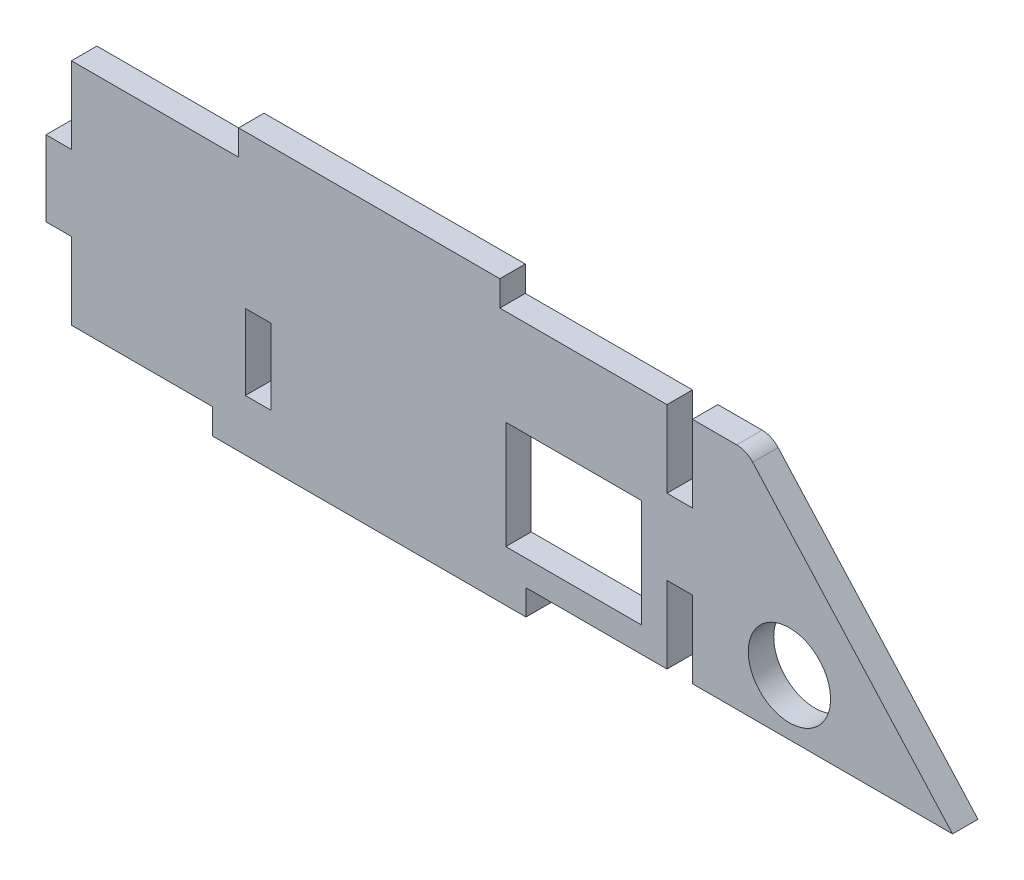
ISO-10303-21;
HEADER;
FILE_DESCRIPTION(('STEP AP214'),'2;1');
FILE_NAME('part.step','',(''),(''),'','','');
FILE_SCHEMA(('AUTOMOTIVE_DESIGN { 1 0 10303 214 1 1 1 1 }'));
ENDSEC;
DATA;
#1=APPLICATION_CONTEXT('core data for automotive mechanical design processes');
#2=APPLICATION_PROTOCOL_DEFINITION('international standard','automotive_design',2000,#1);
#3=PRODUCT_CONTEXT('',#1,'mechanical');
#4=PRODUCT('Part','Part','',(#3));
#5=PRODUCT_RELATED_PRODUCT_CATEGORY('part','',(#4));
#6=PRODUCT_DEFINITION_FORMATION('','',#4);
#7=PRODUCT_DEFINITION_CONTEXT('part definition',#1,'design');
#8=PRODUCT_DEFINITION('design','',#6,#7);
#9=PRODUCT_DEFINITION_SHAPE('','',#8);
#10=(LENGTH_UNIT() NAMED_UNIT(*) SI_UNIT(.MILLI.,.METRE.));
#11=(NAMED_UNIT(*) PLANE_ANGLE_UNIT() SI_UNIT($,.RADIAN.));
#12=(NAMED_UNIT(*) SI_UNIT($,.STERADIAN.) SOLID_ANGLE_UNIT());
#13=UNCERTAINTY_MEASURE_WITH_UNIT(LENGTH_MEASURE(1.E-05),#10,'distance_accuracy_value','');
#14=(GEOMETRIC_REPRESENTATION_CONTEXT(3) GLOBAL_UNCERTAINTY_ASSIGNED_CONTEXT((#13)) GLOBAL_UNIT_ASSIGNED_CONTEXT((#10,
#11,#12)) REPRESENTATION_CONTEXT('',''));
#15=CARTESIAN_POINT('',(0.,0.,0.));
#16=DIRECTION('',(0.,0.,1.));
#17=DIRECTION('',(1.,0.,0.));
#18=AXIS2_PLACEMENT_3D('',#15,#16,#17);
#19=CARTESIAN_POINT('',(-38.1,15.,3.));
#20=DIRECTION('',(0.,-1.,0.));
#21=DIRECTION('',(0.,0.,-1.));
#22=AXIS2_PLACEMENT_3D('',#19,#20,#21);
#23=PLANE('',#22);
#24=DIRECTION('',(-1.,0.,0.));
#25=VECTOR('',#24,1.);
#26=CARTESIAN_POINT('',(-38.1,15.,3.));
#27=LINE('',#26,#25);
#28=CARTESIAN_POINT('',(-15.39875,15.,3.));
#29=VERTEX_POINT('',#28);
#30=CARTESIAN_POINT('',(-35.1,15.,3.));
#31=VERTEX_POINT('',#30);
#32=EDGE_CURVE('E491',#29,#31,#27,.T.);
#33=ORIENTED_EDGE('',*,*,#32,.F.);
#34=DIRECTION('',(0.,0.,1.));
#35=VECTOR('',#34,1.);
#36=CARTESIAN_POINT('',(-15.39875,15.,-30.9432707749197));
#37=LINE('',#36,#35);
#38=CARTESIAN_POINT('',(-15.39875,15.,0.));
#39=VERTEX_POINT('',#38);
#40=EDGE_CURVE('E534',#39,#29,#37,.T.);
#41=ORIENTED_EDGE('',*,*,#40,.F.);
#42=DIRECTION('',(-1.,0.,0.));
#43=VECTOR('',#42,1.);
#44=CARTESIAN_POINT('',(-38.1,15.,0.));
#45=LINE('',#44,#43);
#46=CARTESIAN_POINT('',(-35.1,15.,0.));
#47=VERTEX_POINT('',#46);
#48=EDGE_CURVE('E438',#39,#47,#45,.T.);
#49=ORIENTED_EDGE('',*,*,#48,.T.);
#50=DIRECTION('',(0.,0.,1.));
#51=VECTOR('',#50,1.);
#52=CARTESIAN_POINT('',(-35.1,15.,-9.53902641782694));
#53=LINE('',#52,#51);
#54=EDGE_CURVE('E714',#47,#31,#53,.T.);
#55=ORIENTED_EDGE('',*,*,#54,.T.);
#56=EDGE_LOOP('',(#33,#41,#49,#55));
#57=FACE_BOUND('',#56,.T.);
#58=ADVANCED_FACE('F48',(#57),#23,.F.);
#59=CARTESIAN_POINT('',(35.1,15.,0.));
#60=VERTEX_POINT('',#59);
#61=CARTESIAN_POINT('',(15.39875,15.,0.));
#62=VERTEX_POINT('',#61);
#63=EDGE_CURVE('E480',#60,#62,#45,.T.);
#64=ORIENTED_EDGE('',*,*,#63,.T.);
#65=DIRECTION('',(0.,0.,1.));
#66=VECTOR('',#65,1.);
#67=CARTESIAN_POINT('',(15.39875,15.,-30.9432707749197));
#68=LINE('',#67,#66);
#69=CARTESIAN_POINT('',(15.39875,15.,3.));
#70=VERTEX_POINT('',#69);
#71=EDGE_CURVE('E538',#62,#70,#68,.T.);
#72=ORIENTED_EDGE('',*,*,#71,.T.);
#73=CARTESIAN_POINT('',(35.1,15.,3.));
#74=VERTEX_POINT('',#73);
#75=EDGE_CURVE('E793',#74,#70,#27,.T.);
#76=ORIENTED_EDGE('',*,*,#75,.F.);
#77=DIRECTION('',(0.,0.,1.));
#78=VECTOR('',#77,1.);
#79=CARTESIAN_POINT('',(35.1,15.,-9.53902641782694));
#80=LINE('',#79,#78);
#81=EDGE_CURVE('E725',#60,#74,#80,.T.);
#82=ORIENTED_EDGE('',*,*,#81,.F.);
#83=EDGE_LOOP('',(#64,#72,#76,#82));
#84=FACE_BOUND('',#83,.T.);
#85=ADVANCED_FACE('F643',(#84),#23,.F.);
#86=CARTESIAN_POINT('',(-38.1,-15.,3.));
#87=DIRECTION('',(1.,0.,0.));
#88=DIRECTION('',(0.,0.,-1.));
#89=AXIS2_PLACEMENT_3D('',#86,#87,#88);
#90=PLANE('',#89);
#91=DIRECTION('',(0.,-1.,0.));
#92=VECTOR('',#91,1.);
#93=CARTESIAN_POINT('',(-38.1,-15.,3.));
#94=LINE('',#93,#92);
#95=CARTESIAN_POINT('',(-38.1,5.94500000000001,3.));
#96=VERTEX_POINT('',#95);
#97=CARTESIAN_POINT('',(-38.1,-2.94499999999998,3.));
#98=VERTEX_POINT('',#97);
#99=EDGE_CURVE('E478',#96,#98,#94,.T.);
#100=ORIENTED_EDGE('',*,*,#99,.F.);
#101=DIRECTION('',(0.,0.,1.));
#102=VECTOR('',#101,1.);
#103=CARTESIAN_POINT('',(-38.1,5.94500000000001,-9.53902641782694));
#104=LINE('',#103,#102);
#105=CARTESIAN_POINT('',(-38.1,5.94500000000001,0.));
#106=VERTEX_POINT('',#105);
#107=EDGE_CURVE('E700',#106,#96,#104,.T.);
#108=ORIENTED_EDGE('',*,*,#107,.F.);
#109=DIRECTION('',(0.,-1.,0.));
#110=VECTOR('',#109,1.);
#111=CARTESIAN_POINT('',(-38.1,-15.,0.));
#112=LINE('',#111,#110);
#113=CARTESIAN_POINT('',(-38.1,-2.94499999999998,0.));
#114=VERTEX_POINT('',#113);
#115=EDGE_CURVE('E483',#106,#114,#112,.T.);
#116=ORIENTED_EDGE('',*,*,#115,.T.);
#117=DIRECTION('',(0.,0.,1.));
#118=VECTOR('',#117,1.);
#119=CARTESIAN_POINT('',(-38.1,-2.94499999999998,-9.53902641782694));
#120=LINE('',#119,#118);
#121=EDGE_CURVE('E453',#114,#98,#120,.T.);
#122=ORIENTED_EDGE('',*,*,#121,.T.);
#123=EDGE_LOOP('',(#100,#108,#116,#122));
#124=FACE_BOUND('',#123,.T.);
#125=ADVANCED_FACE('F648',(#124),#90,.F.);
#126=CARTESIAN_POINT('',(-38.1,-15.,3.));
#127=DIRECTION('',(0.,1.,0.));
#128=DIRECTION('',(0.,0.,1.));
#129=AXIS2_PLACEMENT_3D('',#126,#127,#128);
#130=PLANE('',#129);
#131=DIRECTION('',(1.,0.,0.));
#132=VECTOR('',#131,1.);
#133=CARTESIAN_POINT('',(-38.1,-15.,3.));
#134=LINE('',#133,#132);
#135=CARTESIAN_POINT('',(-18.4785,-15.,3.));
#136=VERTEX_POINT('',#135);
#137=CARTESIAN_POINT('',(18.4785,-15.,3.));
#138=VERTEX_POINT('',#137);
#139=EDGE_CURVE('E472',#136,#138,#134,.T.);
#140=ORIENTED_EDGE('',*,*,#139,.F.);
#141=DIRECTION('',(0.,0.,1.));
#142=VECTOR('',#141,1.);
#143=CARTESIAN_POINT('',(-18.4785,-15.,-19.8495154159994));
#144=LINE('',#143,#142);
#145=CARTESIAN_POINT('',(-18.4785,-15.,0.));
#146=VERTEX_POINT('',#145);
#147=EDGE_CURVE('E426',#146,#136,#144,.T.);
#148=ORIENTED_EDGE('',*,*,#147,.F.);
#149=DIRECTION('',(1.,0.,0.));
#150=VECTOR('',#149,1.);
#151=CARTESIAN_POINT('',(-38.1,-15.,0.));
#152=LINE('',#151,#150);
#153=CARTESIAN_POINT('',(18.4785,-15.,0.));
#154=VERTEX_POINT('',#153);
#155=EDGE_CURVE('E487',#146,#154,#152,.T.);
#156=ORIENTED_EDGE('',*,*,#155,.T.);
#157=DIRECTION('',(0.,0.,1.));
#158=VECTOR('',#157,1.);
#159=CARTESIAN_POINT('',(18.4785,-15.,-19.8495154159994));
#160=LINE('',#159,#158);
#161=EDGE_CURVE('E448',#154,#138,#160,.T.);
#162=ORIENTED_EDGE('',*,*,#161,.T.);
#163=EDGE_LOOP('',(#140,#148,#156,#162));
#164=FACE_BOUND('',#163,.T.);
#165=ADVANCED_FACE('F333',(#164),#130,.F.);
#166=CARTESIAN_POINT('',(0.,0.,3.));
#167=DIRECTION('',(0.,0.,-1.));
#168=DIRECTION('',(-1.,0.,0.));
#169=AXIS2_PLACEMENT_3D('',#166,#167,#168);
#170=PLANE('',#169);
#171=DIRECTION('',(1.,0.,0.));
#172=VECTOR('',#171,1.);
#173=CARTESIAN_POINT('',(-11.6,-8.9252,3.));
#174=LINE('',#173,#172);
#175=CARTESIAN_POINT('',(-14.6,-8.9252,3.));
#176=VERTEX_POINT('',#175);
#177=CARTESIAN_POINT('',(-11.6,-8.9252,3.));
#178=VERTEX_POINT('',#177);
#179=EDGE_CURVE('E317',#176,#178,#174,.T.);
#180=ORIENTED_EDGE('',*,*,#179,.F.);
#181=DIRECTION('',(0.,-1.,0.));
#182=VECTOR('',#181,1.);
#183=CARTESIAN_POINT('',(-14.6,-8.9252,3.));
#184=LINE('',#183,#182);
#185=CARTESIAN_POINT('',(-14.6,-0.0352000000000035,3.));
#186=VERTEX_POINT('',#185);
#187=EDGE_CURVE('E303',#186,#176,#184,.T.);
#188=ORIENTED_EDGE('',*,*,#187,.F.);
#189=DIRECTION('',(-1.,0.,0.));
#190=VECTOR('',#189,1.);
#191=CARTESIAN_POINT('',(-11.6,-0.0352000000000035,3.));
#192=LINE('',#191,#190);
#193=CARTESIAN_POINT('',(-11.6,-0.0352000000000035,3.));
#194=VERTEX_POINT('',#193);
#195=EDGE_CURVE('E298',#194,#186,#192,.T.);
#196=ORIENTED_EDGE('',*,*,#195,.F.);
#197=DIRECTION('',(0.,1.,0.));
#198=VECTOR('',#197,1.);
#199=CARTESIAN_POINT('',(-11.6,-8.9252,3.));
#200=LINE('',#199,#198);
#201=EDGE_CURVE('E269',#178,#194,#200,.T.);
#202=ORIENTED_EDGE('',*,*,#201,.F.);
#203=EDGE_LOOP('',(#180,#188,#196,#202));
#204=FACE_BOUND('',#203,.T.);
#205=CARTESIAN_POINT('',(49.53,-5.42,3.));
#206=DIRECTION('',(0.,0.,-1.));
#207=DIRECTION('',(-1.,0.,0.));
#208=AXIS2_PLACEMENT_3D('',#205,#206,#207);
#209=CIRCLE('',#208,4.85);
#210=CARTESIAN_POINT('',(44.68,-5.42,3.));
#211=VERTEX_POINT('',#210);
#212=EDGE_CURVE('E338',#211,#211,#209,.F.);
#213=ORIENTED_EDGE('',*,*,#212,.F.);
#214=EDGE_LOOP('',(#213));
#215=FACE_BOUND('',#214,.T.);
#216=DIRECTION('',(1.,0.,0.));
#217=VECTOR('',#216,1.);
#218=CARTESIAN_POINT('',(32.1,-8.99999999999999,3.));
#219=LINE('',#218,#217);
#220=CARTESIAN_POINT('',(16.098,-8.99999999999999,3.));
#221=VERTEX_POINT('',#220);
#222=CARTESIAN_POINT('',(32.1,-8.99999999999999,3.));
#223=VERTEX_POINT('',#222);
#224=EDGE_CURVE('E343',#221,#223,#219,.T.);
#225=ORIENTED_EDGE('',*,*,#224,.F.);
#226=DIRECTION('',(0.,-1.,0.));
#227=VECTOR('',#226,1.);
#228=CARTESIAN_POINT('',(16.098,3.70000000000001,3.));
#229=LINE('',#228,#227);
#230=CARTESIAN_POINT('',(16.098,3.70000000000001,3.));
#231=VERTEX_POINT('',#230);
#232=EDGE_CURVE('E574',#231,#221,#229,.T.);
#233=ORIENTED_EDGE('',*,*,#232,.F.);
#234=DIRECTION('',(-1.,0.,0.));
#235=VECTOR('',#234,1.);
#236=CARTESIAN_POINT('',(32.1,3.70000000000001,3.));
#237=LINE('',#236,#235);
#238=CARTESIAN_POINT('',(32.1,3.70000000000001,3.));
#239=VERTEX_POINT('',#238);
#240=EDGE_CURVE('E557',#239,#231,#237,.T.);
#241=ORIENTED_EDGE('',*,*,#240,.F.);
#242=DIRECTION('',(0.,1.,0.));
#243=VECTOR('',#242,1.);
#244=CARTESIAN_POINT('',(32.1,3.70000000000001,3.));
#245=LINE('',#244,#243);
#246=EDGE_CURVE('E600',#223,#239,#245,.T.);
#247=ORIENTED_EDGE('',*,*,#246,.F.);
#248=EDGE_LOOP('',(#225,#233,#241,#247));
#249=FACE_BOUND('',#248,.T.);
#250=DIRECTION('',(-0.669130606358857,0.743144825477395,0.));
#251=VECTOR('',#250,1.);
#252=CARTESIAN_POINT('',(44.45,15.,3.));
#253=LINE('',#252,#251);
#254=CARTESIAN_POINT('',(68.7609091960416,-12.,3.));
#255=VERTEX_POINT('',#254);
#256=CARTESIAN_POINT('',(45.2067069960289,14.1595917401515,3.));
#257=VERTEX_POINT('',#256);
#258=EDGE_CURVE('E347',#255,#257,#253,.T.);
#259=ORIENTED_EDGE('',*,*,#258,.T.);
#260=CARTESIAN_POINT('',(43.3191191393163,12.46,3.));
#261=DIRECTION('',(0.,0.,-1.));
#262=DIRECTION('',(-1.,0.,0.));
#263=AXIS2_PLACEMENT_3D('',#260,#261,#262);
#264=CIRCLE('',#263,2.54);
#265=CARTESIAN_POINT('',(43.3191191393163,15.,3.));
#266=VERTEX_POINT('',#265);
#267=EDGE_CURVE('E348',#257,#266,#264,.F.);
#268=ORIENTED_EDGE('',*,*,#267,.T.);
#269=DIRECTION('',(-1.,0.,0.));
#270=VECTOR('',#269,1.);
#271=CARTESIAN_POINT('',(38.1,15.,3.));
#272=LINE('',#271,#270);
#273=CARTESIAN_POINT('',(38.1,15.,3.));
#274=VERTEX_POINT('',#273);
#275=EDGE_CURVE('E377',#266,#274,#272,.T.);
#276=ORIENTED_EDGE('',*,*,#275,.T.);
#277=DIRECTION('',(0.,-1.,0.));
#278=VECTOR('',#277,1.);
#279=CARTESIAN_POINT('',(38.1,15.,3.));
#280=LINE('',#279,#278);
#281=CARTESIAN_POINT('',(38.1,5.94500000000001,3.));
#282=VERTEX_POINT('',#281);
#283=EDGE_CURVE('E362',#274,#282,#280,.T.);
#284=ORIENTED_EDGE('',*,*,#283,.T.);
#285=DIRECTION('',(1.,0.,0.));
#286=VECTOR('',#285,1.);
#287=CARTESIAN_POINT('',(35.1,5.94500000000001,3.));
#288=LINE('',#287,#286);
#289=CARTESIAN_POINT('',(35.1,5.94500000000001,3.));
#290=VERTEX_POINT('',#289);
#291=EDGE_CURVE('E722',#290,#282,#288,.T.);
#292=ORIENTED_EDGE('',*,*,#291,.F.);
#293=DIRECTION('',(0.,-1.,0.));
#294=VECTOR('',#293,1.);
#295=CARTESIAN_POINT('',(35.1,5.94500000000001,3.));
#296=LINE('',#295,#294);
#297=EDGE_CURVE('E718',#74,#290,#296,.T.);
#298=ORIENTED_EDGE('',*,*,#297,.F.);
#299=ORIENTED_EDGE('',*,*,#75,.T.);
#300=DIRECTION('',(0.,1.,0.));
#301=VECTOR('',#300,1.);
#302=CARTESIAN_POINT('',(15.39875,18.,3.));
#303=LINE('',#302,#301);
#304=CARTESIAN_POINT('',(15.39875,18.,3.));
#305=VERTEX_POINT('',#304);
#306=EDGE_CURVE('E551',#70,#305,#303,.T.);
#307=ORIENTED_EDGE('',*,*,#306,.T.);
#308=DIRECTION('',(-1.,0.,0.));
#309=VECTOR('',#308,1.);
#310=CARTESIAN_POINT('',(-15.39875,18.,3.));
#311=LINE('',#310,#309);
#312=CARTESIAN_POINT('',(-15.39875,18.,3.));
#313=VERTEX_POINT('',#312);
#314=EDGE_CURVE('E556',#305,#313,#311,.T.);
#315=ORIENTED_EDGE('',*,*,#314,.T.);
#316=DIRECTION('',(0.,-1.,0.));
#317=VECTOR('',#316,1.);
#318=CARTESIAN_POINT('',(-15.39875,18.,3.));
#319=LINE('',#318,#317);
#320=EDGE_CURVE('E550',#313,#29,#319,.T.);
#321=ORIENTED_EDGE('',*,*,#320,.T.);
#322=ORIENTED_EDGE('',*,*,#32,.T.);
#323=DIRECTION('',(0.,1.,0.));
#324=VECTOR('',#323,1.);
#325=CARTESIAN_POINT('',(-35.1,5.94500000000001,3.));
#326=LINE('',#325,#324);
#327=CARTESIAN_POINT('',(-35.1,5.94500000000001,3.));
#328=VERTEX_POINT('',#327);
#329=EDGE_CURVE('E693',#328,#31,#326,.T.);
#330=ORIENTED_EDGE('',*,*,#329,.F.);
#331=DIRECTION('',(1.,0.,0.));
#332=VECTOR('',#331,1.);
#333=CARTESIAN_POINT('',(-35.1,5.94500000000001,3.));
#334=LINE('',#333,#332);
#335=EDGE_CURVE('E696',#96,#328,#334,.T.);
#336=ORIENTED_EDGE('',*,*,#335,.F.);
#337=ORIENTED_EDGE('',*,*,#99,.T.);
#338=DIRECTION('',(-1.,0.,0.));
#339=VECTOR('',#338,1.);
#340=CARTESIAN_POINT('',(-35.1,-2.94499999999998,3.));
#341=LINE('',#340,#339);
#342=CARTESIAN_POINT('',(-35.1,-2.94499999999998,3.));
#343=VERTEX_POINT('',#342);
#344=EDGE_CURVE('E403',#343,#98,#341,.T.);
#345=ORIENTED_EDGE('',*,*,#344,.F.);
#346=DIRECTION('',(0.,1.,0.));
#347=VECTOR('',#346,1.);
#348=CARTESIAN_POINT('',(-35.1,-2.94499999999998,3.));
#349=LINE('',#348,#347);
#350=CARTESIAN_POINT('',(-35.1,-12.,3.));
#351=VERTEX_POINT('',#350);
#352=EDGE_CURVE('E408',#351,#343,#349,.T.);
#353=ORIENTED_EDGE('',*,*,#352,.F.);
#354=DIRECTION('',(-1.,0.,0.));
#355=VECTOR('',#354,1.);
#356=CARTESIAN_POINT('',(-38.1,-12.,3.));
#357=LINE('',#356,#355);
#358=CARTESIAN_POINT('',(-18.4785,-12.,3.));
#359=VERTEX_POINT('',#358);
#360=EDGE_CURVE('E421',#359,#351,#357,.T.);
#361=ORIENTED_EDGE('',*,*,#360,.F.);
#362=DIRECTION('',(0.,1.,0.));
#363=VECTOR('',#362,1.);
#364=CARTESIAN_POINT('',(-18.4785,-15.,3.));
#365=LINE('',#364,#363);
#366=EDGE_CURVE('E427',#136,#359,#365,.T.);
#367=ORIENTED_EDGE('',*,*,#366,.F.);
#368=ORIENTED_EDGE('',*,*,#139,.T.);
#369=DIRECTION('',(0.,-1.,0.));
#370=VECTOR('',#369,1.);
#371=CARTESIAN_POINT('',(18.4785,-15.,3.));
#372=LINE('',#371,#370);
#373=CARTESIAN_POINT('',(18.4785,-12.,3.));
#374=VERTEX_POINT('',#373);
#375=EDGE_CURVE('E433',#374,#138,#372,.T.);
#376=ORIENTED_EDGE('',*,*,#375,.F.);
#377=DIRECTION('',(-1.,0.,0.));
#378=VECTOR('',#377,1.);
#379=CARTESIAN_POINT('',(18.4785,-12.,3.));
#380=LINE('',#379,#378);
#381=CARTESIAN_POINT('',(35.1,-12.,3.));
#382=VERTEX_POINT('',#381);
#383=EDGE_CURVE('E461',#382,#374,#380,.T.);
#384=ORIENTED_EDGE('',*,*,#383,.F.);
#385=DIRECTION('',(0.,-1.,0.));
#386=VECTOR('',#385,1.);
#387=CARTESIAN_POINT('',(35.1,-2.94499999999999,3.));
#388=LINE('',#387,#386);
#389=CARTESIAN_POINT('',(35.1,-2.94499999999999,3.));
#390=VERTEX_POINT('',#389);
#391=EDGE_CURVE('E399',#390,#382,#388,.T.);
#392=ORIENTED_EDGE('',*,*,#391,.F.);
#393=DIRECTION('',(-1.,0.,0.));
#394=VECTOR('',#393,1.);
#395=CARTESIAN_POINT('',(35.1,-2.94499999999999,3.));
#396=LINE('',#395,#394);
#397=CARTESIAN_POINT('',(38.1,-2.94499999999999,3.));
#398=VERTEX_POINT('',#397);
#399=EDGE_CURVE('E394',#398,#390,#396,.T.);
#400=ORIENTED_EDGE('',*,*,#399,.F.);
#401=CARTESIAN_POINT('',(38.1,-12.,3.));
#402=VERTEX_POINT('',#401);
#403=EDGE_CURVE('E381',#398,#402,#280,.T.);
#404=ORIENTED_EDGE('',*,*,#403,.T.);
#405=DIRECTION('',(1.,0.,0.));
#406=VECTOR('',#405,1.);
#407=CARTESIAN_POINT('',(44.45,-12.,3.));
#408=LINE('',#407,#406);
#409=EDGE_CURVE('E351',#402,#255,#408,.T.);
#410=ORIENTED_EDGE('',*,*,#409,.T.);
#411=EDGE_LOOP('',(#259,#268,#276,#284,#292,#298,#299,#307,#315,#321,#322,#330,#336,#337,#345,
#353,#361,#367,#368,#376,#384,#392,#400,#404,#410));
#412=FACE_BOUND('',#411,.T.);
#413=ADVANCED_FACE('F330',(#204,#215,#249,#412),#170,.F.);
#414=CARTESIAN_POINT('',(0.,0.,0.));
#415=DIRECTION('',(0.,0.,-1.));
#416=DIRECTION('',(-1.,0.,0.));
#417=AXIS2_PLACEMENT_3D('',#414,#415,#416);
#418=PLANE('',#417);
#419=DIRECTION('',(0.,1.,0.));
#420=VECTOR('',#419,1.);
#421=CARTESIAN_POINT('',(-14.6,-8.9252,0.));
#422=LINE('',#421,#420);
#423=CARTESIAN_POINT('',(-14.6,-8.9252,0.));
#424=VERTEX_POINT('',#423);
#425=CARTESIAN_POINT('',(-14.6,-0.0352000000000035,0.));
#426=VERTEX_POINT('',#425);
#427=EDGE_CURVE('E72',#424,#426,#422,.T.);
#428=ORIENTED_EDGE('',*,*,#427,.F.);
#429=DIRECTION('',(-1.,0.,0.));
#430=VECTOR('',#429,1.);
#431=CARTESIAN_POINT('',(-11.6,-8.9252,0.));
#432=LINE('',#431,#430);
#433=CARTESIAN_POINT('',(-11.6,-8.9252,0.));
#434=VERTEX_POINT('',#433);
#435=EDGE_CURVE('E284',#434,#424,#432,.T.);
#436=ORIENTED_EDGE('',*,*,#435,.F.);
#437=DIRECTION('',(0.,-1.,0.));
#438=VECTOR('',#437,1.);
#439=CARTESIAN_POINT('',(-11.6,-8.9252,0.));
#440=LINE('',#439,#438);
#441=CARTESIAN_POINT('',(-11.6,-0.0352000000000035,0.));
#442=VERTEX_POINT('',#441);
#443=EDGE_CURVE('E266',#442,#434,#440,.T.);
#444=ORIENTED_EDGE('',*,*,#443,.F.);
#445=DIRECTION('',(1.,0.,0.));
#446=VECTOR('',#445,1.);
#447=CARTESIAN_POINT('',(-11.6,-0.0352000000000035,0.));
#448=LINE('',#447,#446);
#449=EDGE_CURVE('E276',#426,#442,#448,.T.);
#450=ORIENTED_EDGE('',*,*,#449,.F.);
#451=EDGE_LOOP('',(#428,#436,#444,#450));
#452=FACE_BOUND('',#451,.T.);
#453=CARTESIAN_POINT('',(49.53,-5.42,0.));
#454=DIRECTION('',(0.,0.,-1.));
#455=DIRECTION('',(-1.,0.,0.));
#456=AXIS2_PLACEMENT_3D('',#453,#454,#455);
#457=CIRCLE('',#456,4.85);
#458=CARTESIAN_POINT('',(44.68,-5.42,0.));
#459=VERTEX_POINT('',#458);
#460=EDGE_CURVE('E302',#459,#459,#457,.T.);
#461=ORIENTED_EDGE('',*,*,#460,.F.);
#462=EDGE_LOOP('',(#461));
#463=FACE_BOUND('',#462,.T.);
#464=DIRECTION('',(0.,1.,0.));
#465=VECTOR('',#464,1.);
#466=CARTESIAN_POINT('',(16.098,3.70000000000001,0.));
#467=LINE('',#466,#465);
#468=CARTESIAN_POINT('',(16.098,-8.99999999999999,0.));
#469=VERTEX_POINT('',#468);
#470=CARTESIAN_POINT('',(16.098,3.70000000000001,0.));
#471=VERTEX_POINT('',#470);
#472=EDGE_CURVE('E582',#469,#471,#467,.T.);
#473=ORIENTED_EDGE('',*,*,#472,.F.);
#474=DIRECTION('',(-1.,0.,0.));
#475=VECTOR('',#474,1.);
#476=CARTESIAN_POINT('',(32.1,-8.99999999999999,0.));
#477=LINE('',#476,#475);
#478=CARTESIAN_POINT('',(32.1,-8.99999999999999,0.));
#479=VERTEX_POINT('',#478);
#480=EDGE_CURVE('E593',#479,#469,#477,.T.);
#481=ORIENTED_EDGE('',*,*,#480,.F.);
#482=DIRECTION('',(0.,-1.,0.));
#483=VECTOR('',#482,1.);
#484=CARTESIAN_POINT('',(32.1,3.70000000000001,0.));
#485=LINE('',#484,#483);
#486=CARTESIAN_POINT('',(32.1,3.70000000000001,0.));
#487=VERTEX_POINT('',#486);
#488=EDGE_CURVE('E589',#487,#479,#485,.T.);
#489=ORIENTED_EDGE('',*,*,#488,.F.);
#490=DIRECTION('',(1.,0.,0.));
#491=VECTOR('',#490,1.);
#492=CARTESIAN_POINT('',(32.1,3.70000000000001,0.));
#493=LINE('',#492,#491);
#494=EDGE_CURVE('E585',#471,#487,#493,.T.);
#495=ORIENTED_EDGE('',*,*,#494,.F.);
#496=EDGE_LOOP('',(#473,#481,#489,#495));
#497=FACE_BOUND('',#496,.T.);
#498=DIRECTION('',(-1.,0.,0.));
#499=VECTOR('',#498,1.);
#500=CARTESIAN_POINT('',(38.1,15.,0.));
#501=LINE('',#500,#499);
#502=CARTESIAN_POINT('',(43.3191191393163,15.,0.));
#503=VERTEX_POINT('',#502);
#504=CARTESIAN_POINT('',(38.1,15.,0.));
#505=VERTEX_POINT('',#504);
#506=EDGE_CURVE('E356',#503,#505,#501,.T.);
#507=ORIENTED_EDGE('',*,*,#506,.F.);
#508=CARTESIAN_POINT('',(43.3191191393163,12.46,0.));
#509=DIRECTION('',(0.,0.,-1.));
#510=DIRECTION('',(-1.,0.,0.));
#511=AXIS2_PLACEMENT_3D('',#508,#509,#510);
#512=CIRCLE('',#511,2.54);
#513=CARTESIAN_POINT('',(45.2067069960289,14.1595917401515,0.));
#514=VERTEX_POINT('',#513);
#515=EDGE_CURVE('E12',#503,#514,#512,.T.);
#516=ORIENTED_EDGE('',*,*,#515,.T.);
#517=DIRECTION('',(-0.669130606358857,0.743144825477395,0.));
#518=VECTOR('',#517,1.);
#519=CARTESIAN_POINT('',(44.45,15.,0.));
#520=LINE('',#519,#518);
#521=CARTESIAN_POINT('',(68.7609091960416,-12.,0.));
#522=VERTEX_POINT('',#521);
#523=EDGE_CURVE('E383',#522,#514,#520,.T.);
#524=ORIENTED_EDGE('',*,*,#523,.F.);
#525=DIRECTION('',(1.,0.,0.));
#526=VECTOR('',#525,1.);
#527=CARTESIAN_POINT('',(38.1,-12.,0.));
#528=LINE('',#527,#526);
#529=CARTESIAN_POINT('',(38.1,-12.,0.));
#530=VERTEX_POINT('',#529);
#531=EDGE_CURVE('E516',#530,#522,#528,.T.);
#532=ORIENTED_EDGE('',*,*,#531,.F.);
#533=DIRECTION('',(0.,-1.,0.));
#534=VECTOR('',#533,1.);
#535=CARTESIAN_POINT('',(38.1,15.,0.));
#536=LINE('',#535,#534);
#537=CARTESIAN_POINT('',(38.1,-2.94499999999999,0.));
#538=VERTEX_POINT('',#537);
#539=EDGE_CURVE('E360',#538,#530,#536,.T.);
#540=ORIENTED_EDGE('',*,*,#539,.F.);
#541=DIRECTION('',(-1.,0.,0.));
#542=VECTOR('',#541,1.);
#543=CARTESIAN_POINT('',(35.1,-2.94499999999999,0.));
#544=LINE('',#543,#542);
#545=CARTESIAN_POINT('',(35.1,-2.94499999999999,0.));
#546=VERTEX_POINT('',#545);
#547=EDGE_CURVE('E745',#538,#546,#544,.T.);
#548=ORIENTED_EDGE('',*,*,#547,.T.);
#549=DIRECTION('',(0.,-1.,0.));
#550=VECTOR('',#549,1.);
#551=CARTESIAN_POINT('',(35.1,-2.94499999999999,0.));
#552=LINE('',#551,#550);
#553=CARTESIAN_POINT('',(35.1,-12.,0.));
#554=VERTEX_POINT('',#553);
#555=EDGE_CURVE('E752',#546,#554,#552,.T.);
#556=ORIENTED_EDGE('',*,*,#555,.T.);
#557=DIRECTION('',(-1.,0.,0.));
#558=VECTOR('',#557,1.);
#559=CARTESIAN_POINT('',(18.4785,-12.,0.));
#560=LINE('',#559,#558);
#561=CARTESIAN_POINT('',(18.4785,-12.,0.));
#562=VERTEX_POINT('',#561);
#563=EDGE_CURVE('E458',#554,#562,#560,.T.);
#564=ORIENTED_EDGE('',*,*,#563,.T.);
#565=DIRECTION('',(0.,-1.,0.));
#566=VECTOR('',#565,1.);
#567=CARTESIAN_POINT('',(18.4785,-15.,0.));
#568=LINE('',#567,#566);
#569=EDGE_CURVE('E452',#562,#154,#568,.T.);
#570=ORIENTED_EDGE('',*,*,#569,.T.);
#571=ORIENTED_EDGE('',*,*,#155,.F.);
#572=DIRECTION('',(0.,1.,0.));
#573=VECTOR('',#572,1.);
#574=CARTESIAN_POINT('',(-18.4785,-15.,0.));
#575=LINE('',#574,#573);
#576=CARTESIAN_POINT('',(-18.4785,-12.,0.));
#577=VERTEX_POINT('',#576);
#578=EDGE_CURVE('E440',#146,#577,#575,.T.);
#579=ORIENTED_EDGE('',*,*,#578,.T.);
#580=DIRECTION('',(-1.,0.,0.));
#581=VECTOR('',#580,1.);
#582=CARTESIAN_POINT('',(-38.1,-12.,0.));
#583=LINE('',#582,#581);
#584=CARTESIAN_POINT('',(-35.1,-12.,0.));
#585=VERTEX_POINT('',#584);
#586=EDGE_CURVE('E434',#577,#585,#583,.T.);
#587=ORIENTED_EDGE('',*,*,#586,.T.);
#588=DIRECTION('',(0.,1.,0.));
#589=VECTOR('',#588,1.);
#590=CARTESIAN_POINT('',(-35.1,-2.94499999999998,0.));
#591=LINE('',#590,#589);
#592=CARTESIAN_POINT('',(-35.1,-2.94499999999998,0.));
#593=VERTEX_POINT('',#592);
#594=EDGE_CURVE('E687',#585,#593,#591,.T.);
#595=ORIENTED_EDGE('',*,*,#594,.T.);
#596=DIRECTION('',(-1.,0.,0.));
#597=VECTOR('',#596,1.);
#598=CARTESIAN_POINT('',(-35.1,-2.94499999999998,0.));
#599=LINE('',#598,#597);
#600=EDGE_CURVE('E681',#593,#114,#599,.T.);
#601=ORIENTED_EDGE('',*,*,#600,.T.);
#602=ORIENTED_EDGE('',*,*,#115,.F.);
#603=DIRECTION('',(1.,0.,0.));
#604=VECTOR('',#603,1.);
#605=CARTESIAN_POINT('',(-35.1,5.94500000000001,0.));
#606=LINE('',#605,#604);
#607=CARTESIAN_POINT('',(-35.1,5.94500000000001,0.));
#608=VERTEX_POINT('',#607);
#609=EDGE_CURVE('E703',#106,#608,#606,.T.);
#610=ORIENTED_EDGE('',*,*,#609,.T.);
#611=DIRECTION('',(0.,1.,0.));
#612=VECTOR('',#611,1.);
#613=CARTESIAN_POINT('',(-35.1,5.94500000000001,0.));
#614=LINE('',#613,#612);
#615=EDGE_CURVE('E710',#608,#47,#614,.T.);
#616=ORIENTED_EDGE('',*,*,#615,.T.);
#617=ORIENTED_EDGE('',*,*,#48,.F.);
#618=DIRECTION('',(0.,-1.,0.));
#619=VECTOR('',#618,1.);
#620=CARTESIAN_POINT('',(-15.39875,18.,0.));
#621=LINE('',#620,#619);
#622=CARTESIAN_POINT('',(-15.39875,18.,0.));
#623=VERTEX_POINT('',#622);
#624=EDGE_CURVE('E532',#623,#39,#621,.T.);
#625=ORIENTED_EDGE('',*,*,#624,.F.);
#626=DIRECTION('',(-1.,0.,0.));
#627=VECTOR('',#626,1.);
#628=CARTESIAN_POINT('',(-15.39875,18.,0.));
#629=LINE('',#628,#627);
#630=CARTESIAN_POINT('',(15.39875,18.,0.));
#631=VERTEX_POINT('',#630);
#632=EDGE_CURVE('E533',#631,#623,#629,.T.);
#633=ORIENTED_EDGE('',*,*,#632,.F.);
#634=DIRECTION('',(0.,1.,0.));
#635=VECTOR('',#634,1.);
#636=CARTESIAN_POINT('',(15.39875,18.,0.));
#637=LINE('',#636,#635);
#638=EDGE_CURVE('E528',#62,#631,#637,.T.);
#639=ORIENTED_EDGE('',*,*,#638,.F.);
#640=ORIENTED_EDGE('',*,*,#63,.F.);
#641=DIRECTION('',(0.,-1.,0.));
#642=VECTOR('',#641,1.);
#643=CARTESIAN_POINT('',(35.1,5.94500000000001,0.));
#644=LINE('',#643,#642);
#645=CARTESIAN_POINT('',(35.1,5.94500000000001,0.));
#646=VERTEX_POINT('',#645);
#647=EDGE_CURVE('E728',#60,#646,#644,.T.);
#648=ORIENTED_EDGE('',*,*,#647,.T.);
#649=DIRECTION('',(1.,0.,0.));
#650=VECTOR('',#649,1.);
#651=CARTESIAN_POINT('',(35.1,5.94500000000001,0.));
#652=LINE('',#651,#650);
#653=CARTESIAN_POINT('',(38.1,5.94500000000001,0.));
#654=VERTEX_POINT('',#653);
#655=EDGE_CURVE('E735',#646,#654,#652,.T.);
#656=ORIENTED_EDGE('',*,*,#655,.T.);
#657=EDGE_CURVE('E510',#505,#654,#536,.T.);
#658=ORIENTED_EDGE('',*,*,#657,.F.);
#659=EDGE_LOOP('',(#507,#516,#524,#532,#540,#548,#556,#564,#570,#571,#579,#587,#595,#601,#602,
#610,#616,#617,#625,#633,#639,#640,#648,#656,#658));
#660=FACE_BOUND('',#659,.T.);
#661=ADVANCED_FACE('F281',(#452,#463,#497,#660),#418,.T.);
#662=CARTESIAN_POINT('',(18.4785,-12.,-19.8495154159994));
#663=DIRECTION('',(0.,1.,0.));
#664=DIRECTION('',(0.,0.,1.));
#665=AXIS2_PLACEMENT_3D('',#662,#663,#664);
#666=PLANE('',#665);
#667=ORIENTED_EDGE('',*,*,#563,.F.);
#668=DIRECTION('',(0.,0.,1.));
#669=VECTOR('',#668,1.);
#670=CARTESIAN_POINT('',(35.1,-12.,-9.53902641782694));
#671=LINE('',#670,#669);
#672=EDGE_CURVE('E675',#554,#382,#671,.T.);
#673=ORIENTED_EDGE('',*,*,#672,.T.);
#674=ORIENTED_EDGE('',*,*,#383,.T.);
#675=DIRECTION('',(0.,0.,1.));
#676=VECTOR('',#675,1.);
#677=CARTESIAN_POINT('',(18.4785,-12.,-19.8495154159994));
#678=LINE('',#677,#676);
#679=EDGE_CURVE('E454',#562,#374,#678,.T.);
#680=ORIENTED_EDGE('',*,*,#679,.F.);
#681=EDGE_LOOP('',(#667,#673,#674,#680));
#682=FACE_BOUND('',#681,.T.);
#683=ADVANCED_FACE('F633',(#682),#666,.F.);
#684=CARTESIAN_POINT('',(18.4785,-15.,-19.8495154159994));
#685=DIRECTION('',(-1.,0.,0.));
#686=DIRECTION('',(0.,0.,1.));
#687=AXIS2_PLACEMENT_3D('',#684,#685,#686);
#688=PLANE('',#687);
#689=ORIENTED_EDGE('',*,*,#679,.T.);
#690=ORIENTED_EDGE('',*,*,#375,.T.);
#691=ORIENTED_EDGE('',*,*,#161,.F.);
#692=ORIENTED_EDGE('',*,*,#569,.F.);
#693=EDGE_LOOP('',(#689,#690,#691,#692));
#694=FACE_BOUND('',#693,.T.);
#695=ADVANCED_FACE('F638',(#694),#688,.F.);
#696=CARTESIAN_POINT('',(-18.4785,-15.,-19.8495154159994));
#697=DIRECTION('',(1.,0.,0.));
#698=DIRECTION('',(0.,0.,-1.));
#699=AXIS2_PLACEMENT_3D('',#696,#697,#698);
#700=PLANE('',#699);
#701=ORIENTED_EDGE('',*,*,#147,.T.);
#702=ORIENTED_EDGE('',*,*,#366,.T.);
#703=DIRECTION('',(0.,0.,1.));
#704=VECTOR('',#703,1.);
#705=CARTESIAN_POINT('',(-18.4785,-12.,-19.8495154159994));
#706=LINE('',#705,#704);
#707=EDGE_CURVE('E439',#577,#359,#706,.T.);
#708=ORIENTED_EDGE('',*,*,#707,.F.);
#709=ORIENTED_EDGE('',*,*,#578,.F.);
#710=EDGE_LOOP('',(#701,#702,#708,#709));
#711=FACE_BOUND('',#710,.T.);
#712=ADVANCED_FACE('F667',(#711),#700,.F.);
#713=CARTESIAN_POINT('',(-38.1,-12.,-19.8495154159994));
#714=DIRECTION('',(0.,1.,0.));
#715=DIRECTION('',(-1.,0.,0.));
#716=AXIS2_PLACEMENT_3D('',#713,#714,#715);
#717=PLANE('',#716);
#718=ORIENTED_EDGE('',*,*,#360,.T.);
#719=DIRECTION('',(0.,0.,1.));
#720=VECTOR('',#719,1.);
#721=CARTESIAN_POINT('',(-35.1,-12.,-9.53902641782694));
#722=LINE('',#721,#720);
#723=EDGE_CURVE('E407',#585,#351,#722,.T.);
#724=ORIENTED_EDGE('',*,*,#723,.F.);
#725=ORIENTED_EDGE('',*,*,#586,.F.);
#726=ORIENTED_EDGE('',*,*,#707,.T.);
#727=EDGE_LOOP('',(#718,#724,#725,#726));
#728=FACE_BOUND('',#727,.T.);
#729=ADVANCED_FACE('F813',(#728),#717,.F.);
#730=CARTESIAN_POINT('',(-35.1,-2.94499999999998,-9.53902641782694));
#731=DIRECTION('',(1.,0.,0.));
#732=DIRECTION('',(0.,0.,-1.));
#733=AXIS2_PLACEMENT_3D('',#730,#731,#732);
#734=PLANE('',#733);
#735=ORIENTED_EDGE('',*,*,#723,.T.);
#736=ORIENTED_EDGE('',*,*,#352,.T.);
#737=DIRECTION('',(0.,0.,1.));
#738=VECTOR('',#737,1.);
#739=CARTESIAN_POINT('',(-35.1,-2.94499999999998,-9.53902641782694));
#740=LINE('',#739,#738);
#741=EDGE_CURVE('E685',#593,#343,#740,.T.);
#742=ORIENTED_EDGE('',*,*,#741,.F.);
#743=ORIENTED_EDGE('',*,*,#594,.F.);
#744=EDGE_LOOP('',(#735,#736,#742,#743));
#745=FACE_BOUND('',#744,.T.);
#746=ADVANCED_FACE('F811',(#745),#734,.F.);
#747=CARTESIAN_POINT('',(-35.1,-2.94499999999998,-9.53902641782694));
#748=DIRECTION('',(0.,1.,0.));
#749=DIRECTION('',(0.,0.,1.));
#750=AXIS2_PLACEMENT_3D('',#747,#748,#749);
#751=PLANE('',#750);
#752=ORIENTED_EDGE('',*,*,#741,.T.);
#753=ORIENTED_EDGE('',*,*,#344,.T.);
#754=ORIENTED_EDGE('',*,*,#121,.F.);
#755=ORIENTED_EDGE('',*,*,#600,.F.);
#756=EDGE_LOOP('',(#752,#753,#754,#755));
#757=FACE_BOUND('',#756,.T.);
#758=ADVANCED_FACE('F807',(#757),#751,.F.);
#759=CARTESIAN_POINT('',(35.1,-2.94499999999999,-9.53902641782694));
#760=DIRECTION('',(0.,1.,0.));
#761=DIRECTION('',(-1.,0.,0.));
#762=AXIS2_PLACEMENT_3D('',#759,#760,#761);
#763=PLANE('',#762);
#764=DIRECTION('',(0.,0.,1.));
#765=VECTOR('',#764,1.);
#766=CARTESIAN_POINT('',(38.1,-2.94499999999999,-9.53902641782694));
#767=LINE('',#766,#765);
#768=EDGE_CURVE('E400',#538,#398,#767,.T.);
#769=ORIENTED_EDGE('',*,*,#768,.T.);
#770=ORIENTED_EDGE('',*,*,#399,.T.);
#771=DIRECTION('',(0.,0.,1.));
#772=VECTOR('',#771,1.);
#773=CARTESIAN_POINT('',(35.1,-2.94499999999999,-9.53902641782694));
#774=LINE('',#773,#772);
#775=EDGE_CURVE('E749',#546,#390,#774,.T.);
#776=ORIENTED_EDGE('',*,*,#775,.F.);
#777=ORIENTED_EDGE('',*,*,#547,.F.);
#778=EDGE_LOOP('',(#769,#770,#776,#777));
#779=FACE_BOUND('',#778,.T.);
#780=ADVANCED_FACE('F772',(#779),#763,.F.);
#781=CARTESIAN_POINT('',(35.1,-2.94499999999999,-9.53902641782694));
#782=DIRECTION('',(-1.,0.,0.));
#783=DIRECTION('',(0.,0.,1.));
#784=AXIS2_PLACEMENT_3D('',#781,#782,#783);
#785=PLANE('',#784);
#786=ORIENTED_EDGE('',*,*,#775,.T.);
#787=ORIENTED_EDGE('',*,*,#391,.T.);
#788=ORIENTED_EDGE('',*,*,#672,.F.);
#789=ORIENTED_EDGE('',*,*,#555,.F.);
#790=EDGE_LOOP('',(#786,#787,#788,#789));
#791=FACE_BOUND('',#790,.T.);
#792=ADVANCED_FACE('F775',(#791),#785,.F.);
#793=CARTESIAN_POINT('',(-35.1,5.94500000000001,-9.53902641782694));
#794=DIRECTION('',(0.,-1.,0.));
#795=DIRECTION('',(0.,0.,-1.));
#796=AXIS2_PLACEMENT_3D('',#793,#794,#795);
#797=PLANE('',#796);
#798=ORIENTED_EDGE('',*,*,#107,.T.);
#799=ORIENTED_EDGE('',*,*,#335,.T.);
#800=DIRECTION('',(0.,0.,1.));
#801=VECTOR('',#800,1.);
#802=CARTESIAN_POINT('',(-35.1,5.94500000000001,-9.53902641782694));
#803=LINE('',#802,#801);
#804=EDGE_CURVE('E707',#608,#328,#803,.T.);
#805=ORIENTED_EDGE('',*,*,#804,.F.);
#806=ORIENTED_EDGE('',*,*,#609,.F.);
#807=EDGE_LOOP('',(#798,#799,#805,#806));
#808=FACE_BOUND('',#807,.T.);
#809=ADVANCED_FACE('F871',(#808),#797,.F.);
#810=CARTESIAN_POINT('',(-35.1,5.94500000000001,-9.53902641782694));
#811=DIRECTION('',(1.,0.,0.));
#812=DIRECTION('',(0.,0.,-1.));
#813=AXIS2_PLACEMENT_3D('',#810,#811,#812);
#814=PLANE('',#813);
#815=ORIENTED_EDGE('',*,*,#804,.T.);
#816=ORIENTED_EDGE('',*,*,#329,.T.);
#817=ORIENTED_EDGE('',*,*,#54,.F.);
#818=ORIENTED_EDGE('',*,*,#615,.F.);
#819=EDGE_LOOP('',(#815,#816,#817,#818));
#820=FACE_BOUND('',#819,.T.);
#821=ADVANCED_FACE('F880',(#820),#814,.F.);
#822=CARTESIAN_POINT('',(35.1,5.94500000000001,-9.53902641782694));
#823=DIRECTION('',(-1.,0.,0.));
#824=DIRECTION('',(0.,0.,1.));
#825=AXIS2_PLACEMENT_3D('',#822,#823,#824);
#826=PLANE('',#825);
#827=ORIENTED_EDGE('',*,*,#81,.T.);
#828=ORIENTED_EDGE('',*,*,#297,.T.);
#829=DIRECTION('',(0.,0.,1.));
#830=VECTOR('',#829,1.);
#831=CARTESIAN_POINT('',(35.1,5.94500000000001,-9.53902641782694));
#832=LINE('',#831,#830);
#833=EDGE_CURVE('E732',#646,#290,#832,.T.);
#834=ORIENTED_EDGE('',*,*,#833,.F.);
#835=ORIENTED_EDGE('',*,*,#647,.F.);
#836=EDGE_LOOP('',(#827,#828,#834,#835));
#837=FACE_BOUND('',#836,.T.);
#838=ADVANCED_FACE('F890',(#837),#826,.F.);
#839=CARTESIAN_POINT('',(35.1,5.94500000000001,-9.53902641782694));
#840=DIRECTION('',(0.,-1.,0.));
#841=DIRECTION('',(0.,0.,-1.));
#842=AXIS2_PLACEMENT_3D('',#839,#840,#841);
#843=PLANE('',#842);
#844=ORIENTED_EDGE('',*,*,#833,.T.);
#845=ORIENTED_EDGE('',*,*,#291,.T.);
#846=DIRECTION('',(0.,0.,1.));
#847=VECTOR('',#846,1.);
#848=CARTESIAN_POINT('',(38.1,5.94500000000001,-9.53902641782694));
#849=LINE('',#848,#847);
#850=EDGE_CURVE('E738',#654,#282,#849,.T.);
#851=ORIENTED_EDGE('',*,*,#850,.F.);
#852=ORIENTED_EDGE('',*,*,#655,.F.);
#853=EDGE_LOOP('',(#844,#845,#851,#852));
#854=FACE_BOUND('',#853,.T.);
#855=ADVANCED_FACE('F899',(#854),#843,.F.);
#856=CARTESIAN_POINT('',(38.1,15.,0.));
#857=DIRECTION('',(-1.,0.,0.));
#858=DIRECTION('',(0.,0.,1.));
#859=AXIS2_PLACEMENT_3D('',#856,#857,#858);
#860=PLANE('',#859);
#861=ORIENTED_EDGE('',*,*,#768,.F.);
#862=ORIENTED_EDGE('',*,*,#539,.T.);
#863=DIRECTION('',(0.,0.,1.));
#864=VECTOR('',#863,1.);
#865=CARTESIAN_POINT('',(38.1,-12.,0.));
#866=LINE('',#865,#864);
#867=EDGE_CURVE('E519',#530,#402,#866,.T.);
#868=ORIENTED_EDGE('',*,*,#867,.T.);
#869=ORIENTED_EDGE('',*,*,#403,.F.);
#870=EDGE_LOOP('',(#861,#862,#868,#869));
#871=FACE_BOUND('',#870,.T.);
#872=ADVANCED_FACE('F766',(#871),#860,.T.);
#873=CARTESIAN_POINT('',(38.1,15.,0.));
#874=DIRECTION('',(0.,1.,0.));
#875=DIRECTION('',(0.,0.,1.));
#876=AXIS2_PLACEMENT_3D('',#873,#874,#875);
#877=PLANE('',#876);
#878=ORIENTED_EDGE('',*,*,#275,.F.);
#879=DIRECTION('',(0.,0.,1.));
#880=VECTOR('',#879,1.);
#881=CARTESIAN_POINT('',(43.3191191393163,15.,0.));
#882=LINE('',#881,#880);
#883=EDGE_CURVE('E57',#266,#503,#882,.F.);
#884=ORIENTED_EDGE('',*,*,#883,.T.);
#885=ORIENTED_EDGE('',*,*,#506,.T.);
#886=DIRECTION('',(0.,0.,1.));
#887=VECTOR('',#886,1.);
#888=CARTESIAN_POINT('',(38.1,15.,0.));
#889=LINE('',#888,#887);
#890=EDGE_CURVE('E515',#505,#274,#889,.T.);
#891=ORIENTED_EDGE('',*,*,#890,.T.);
#892=EDGE_LOOP('',(#878,#884,#885,#891));
#893=FACE_BOUND('',#892,.T.);
#894=ADVANCED_FACE('F499',(#893),#877,.T.);
#895=CARTESIAN_POINT('',(44.45,15.,0.));
#896=DIRECTION('',(0.743144825477395,0.669130606358857,0.));
#897=DIRECTION('',(-0.669130606358857,0.743144825477395,0.));
#898=AXIS2_PLACEMENT_3D('',#895,#896,#897);
#899=PLANE('',#898);
#900=ORIENTED_EDGE('',*,*,#523,.T.);
#901=DIRECTION('',(0.,0.,1.));
#902=VECTOR('',#901,1.);
#903=CARTESIAN_POINT('',(45.2067069960289,14.1595917401515,0.));
#904=LINE('',#903,#902);
#905=EDGE_CURVE('E477',#514,#257,#904,.T.);
#906=ORIENTED_EDGE('',*,*,#905,.T.);
#907=ORIENTED_EDGE('',*,*,#258,.F.);
#908=DIRECTION('',(0.,0.,1.));
#909=VECTOR('',#908,1.);
#910=CARTESIAN_POINT('',(68.7609091960416,-12.,0.));
#911=LINE('',#910,#909);
#912=EDGE_CURVE('E367',#522,#255,#911,.T.);
#913=ORIENTED_EDGE('',*,*,#912,.F.);
#914=EDGE_LOOP('',(#900,#906,#907,#913));
#915=FACE_BOUND('',#914,.T.);
#916=ADVANCED_FACE('F512',(#915),#899,.T.);
#917=CARTESIAN_POINT('',(44.45,-12.,0.));
#918=DIRECTION('',(0.,-1.,0.));
#919=DIRECTION('',(0.,0.,-1.));
#920=AXIS2_PLACEMENT_3D('',#917,#918,#919);
#921=PLANE('',#920);
#922=ORIENTED_EDGE('',*,*,#409,.F.);
#923=ORIENTED_EDGE('',*,*,#867,.F.);
#924=ORIENTED_EDGE('',*,*,#531,.T.);
#925=ORIENTED_EDGE('',*,*,#912,.T.);
#926=EDGE_LOOP('',(#922,#923,#924,#925));
#927=FACE_BOUND('',#926,.T.);
#928=ADVANCED_FACE('F768',(#927),#921,.T.);
#929=ORIENTED_EDGE('',*,*,#657,.T.);
#930=ORIENTED_EDGE('',*,*,#850,.T.);
#931=ORIENTED_EDGE('',*,*,#283,.F.);
#932=ORIENTED_EDGE('',*,*,#890,.F.);
#933=EDGE_LOOP('',(#929,#930,#931,#932));
#934=FACE_BOUND('',#933,.T.);
#935=ADVANCED_FACE('F918',(#934),#860,.T.);
#936=CARTESIAN_POINT('',(-15.39875,18.,-30.9432707749197));
#937=DIRECTION('',(0.,1.,0.));
#938=DIRECTION('',(0.,0.,1.));
#939=AXIS2_PLACEMENT_3D('',#936,#937,#938);
#940=PLANE('',#939);
#941=DIRECTION('',(0.,0.,1.));
#942=VECTOR('',#941,1.);
#943=CARTESIAN_POINT('',(15.39875,18.,-30.9432707749197));
#944=LINE('',#943,#942);
#945=EDGE_CURVE('E382',#631,#305,#944,.T.);
#946=ORIENTED_EDGE('',*,*,#945,.F.);
#947=ORIENTED_EDGE('',*,*,#632,.T.);
#948=DIRECTION('',(0.,0.,1.));
#949=VECTOR('',#948,1.);
#950=CARTESIAN_POINT('',(-15.39875,18.,-30.9432707749197));
#951=LINE('',#950,#949);
#952=EDGE_CURVE('E529',#623,#313,#951,.T.);
#953=ORIENTED_EDGE('',*,*,#952,.T.);
#954=ORIENTED_EDGE('',*,*,#314,.F.);
#955=EDGE_LOOP('',(#946,#947,#953,#954));
#956=FACE_BOUND('',#955,.T.);
#957=ADVANCED_FACE('F785',(#956),#940,.T.);
#958=CARTESIAN_POINT('',(-15.39875,18.,-30.9432707749197));
#959=DIRECTION('',(-1.,0.,0.));
#960=DIRECTION('',(0.,0.,1.));
#961=AXIS2_PLACEMENT_3D('',#958,#959,#960);
#962=PLANE('',#961);
#963=ORIENTED_EDGE('',*,*,#952,.F.);
#964=ORIENTED_EDGE('',*,*,#624,.T.);
#965=ORIENTED_EDGE('',*,*,#40,.T.);
#966=ORIENTED_EDGE('',*,*,#320,.F.);
#967=EDGE_LOOP('',(#963,#964,#965,#966));
#968=FACE_BOUND('',#967,.T.);
#969=ADVANCED_FACE('F788',(#968),#962,.T.);
#970=CARTESIAN_POINT('',(15.39875,18.,-30.9432707749197));
#971=DIRECTION('',(1.,0.,0.));
#972=DIRECTION('',(0.,1.,0.));
#973=AXIS2_PLACEMENT_3D('',#970,#971,#972);
#974=PLANE('',#973);
#975=ORIENTED_EDGE('',*,*,#71,.F.);
#976=ORIENTED_EDGE('',*,*,#638,.T.);
#977=ORIENTED_EDGE('',*,*,#945,.T.);
#978=ORIENTED_EDGE('',*,*,#306,.F.);
#979=EDGE_LOOP('',(#975,#976,#977,#978));
#980=FACE_BOUND('',#979,.T.);
#981=ADVANCED_FACE('F970',(#980),#974,.T.);
#982=CARTESIAN_POINT('',(16.098,3.70000000000001,23.4292438430795));
#983=DIRECTION('',(-1.,0.,0.));
#984=DIRECTION('',(0.,0.,1.));
#985=AXIS2_PLACEMENT_3D('',#982,#983,#984);
#986=PLANE('',#985);
#987=ORIENTED_EDGE('',*,*,#232,.T.);
#988=DIRECTION('',(0.,0.,-1.));
#989=VECTOR('',#988,1.);
#990=CARTESIAN_POINT('',(16.098,-8.99999999999999,23.4292438430795));
#991=LINE('',#990,#989);
#992=EDGE_CURVE('E597',#221,#469,#991,.T.);
#993=ORIENTED_EDGE('',*,*,#992,.T.);
#994=ORIENTED_EDGE('',*,*,#472,.T.);
#995=DIRECTION('',(0.,0.,-1.));
#996=VECTOR('',#995,1.);
#997=CARTESIAN_POINT('',(16.098,3.70000000000001,23.4292438430795));
#998=LINE('',#997,#996);
#999=EDGE_CURVE('E575',#231,#471,#998,.T.);
#1000=ORIENTED_EDGE('',*,*,#999,.F.);
#1001=EDGE_LOOP('',(#987,#993,#994,#1000));
#1002=FACE_BOUND('',#1001,.T.);
#1003=ADVANCED_FACE('F979',(#1002),#986,.F.);
#1004=CARTESIAN_POINT('',(32.1,-8.99999999999999,23.4292438430795));
#1005=DIRECTION('',(0.,-1.,0.));
#1006=DIRECTION('',(0.,0.,-1.));
#1007=AXIS2_PLACEMENT_3D('',#1004,#1005,#1006);
#1008=PLANE('',#1007);
#1009=ORIENTED_EDGE('',*,*,#224,.T.);
#1010=DIRECTION('',(0.,0.,-1.));
#1011=VECTOR('',#1010,1.);
#1012=CARTESIAN_POINT('',(32.1,-8.99999999999999,23.4292438430795));
#1013=LINE('',#1012,#1011);
#1014=EDGE_CURVE('E601',#223,#479,#1013,.T.);
#1015=ORIENTED_EDGE('',*,*,#1014,.T.);
#1016=ORIENTED_EDGE('',*,*,#480,.T.);
#1017=ORIENTED_EDGE('',*,*,#992,.F.);
#1018=EDGE_LOOP('',(#1009,#1015,#1016,#1017));
#1019=FACE_BOUND('',#1018,.T.);
#1020=ADVANCED_FACE('F989',(#1019),#1008,.F.);
#1021=CARTESIAN_POINT('',(32.1,3.70000000000001,23.4292438430795));
#1022=DIRECTION('',(1.,0.,0.));
#1023=DIRECTION('',(0.,0.,-1.));
#1024=AXIS2_PLACEMENT_3D('',#1021,#1022,#1023);
#1025=PLANE('',#1024);
#1026=ORIENTED_EDGE('',*,*,#246,.T.);
#1027=DIRECTION('',(0.,0.,-1.));
#1028=VECTOR('',#1027,1.);
#1029=CARTESIAN_POINT('',(32.1,3.70000000000001,23.4292438430795));
#1030=LINE('',#1029,#1028);
#1031=EDGE_CURVE('E603',#239,#487,#1030,.T.);
#1032=ORIENTED_EDGE('',*,*,#1031,.T.);
#1033=ORIENTED_EDGE('',*,*,#488,.T.);
#1034=ORIENTED_EDGE('',*,*,#1014,.F.);
#1035=EDGE_LOOP('',(#1026,#1032,#1033,#1034));
#1036=FACE_BOUND('',#1035,.T.);
#1037=ADVANCED_FACE('F620',(#1036),#1025,.F.);
#1038=CARTESIAN_POINT('',(32.1,3.70000000000001,23.4292438430795));
#1039=DIRECTION('',(0.,1.,0.));
#1040=DIRECTION('',(0.,0.,1.));
#1041=AXIS2_PLACEMENT_3D('',#1038,#1039,#1040);
#1042=PLANE('',#1041);
#1043=ORIENTED_EDGE('',*,*,#240,.T.);
#1044=ORIENTED_EDGE('',*,*,#999,.T.);
#1045=ORIENTED_EDGE('',*,*,#494,.T.);
#1046=ORIENTED_EDGE('',*,*,#1031,.F.);
#1047=EDGE_LOOP('',(#1043,#1044,#1045,#1046));
#1048=FACE_BOUND('',#1047,.T.);
#1049=ADVANCED_FACE('F612',(#1048),#1042,.F.);
#1050=CARTESIAN_POINT('',(49.53,-5.42,16.717871555019));
#1051=DIRECTION('',(0.,0.,-1.));
#1052=DIRECTION('',(-1.,0.,0.));
#1053=AXIS2_PLACEMENT_3D('',#1050,#1051,#1052);
#1054=CYLINDRICAL_SURFACE('',#1053,4.85);
#1055=ORIENTED_EDGE('',*,*,#212,.T.);
#1056=EDGE_LOOP('',(#1055));
#1057=FACE_BOUND('',#1056,.T.);
#1058=ORIENTED_EDGE('',*,*,#460,.T.);
#1059=EDGE_LOOP('',(#1058));
#1060=FACE_BOUND('',#1059,.T.);
#1061=ADVANCED_FACE('F631',(#1057,#1060),#1054,.F.);
#1062=CARTESIAN_POINT('',(43.3191191393163,12.46,0.));
#1063=DIRECTION('',(0.,0.,1.));
#1064=DIRECTION('',(1.,0.,0.));
#1065=AXIS2_PLACEMENT_3D('',#1062,#1063,#1064);
#1066=CYLINDRICAL_SURFACE('',#1065,2.54);
#1067=ORIENTED_EDGE('',*,*,#515,.F.);
#1068=ORIENTED_EDGE('',*,*,#883,.F.);
#1069=ORIENTED_EDGE('',*,*,#267,.F.);
#1070=ORIENTED_EDGE('',*,*,#905,.F.);
#1071=EDGE_LOOP('',(#1067,#1068,#1069,#1070));
#1072=FACE_BOUND('',#1071,.T.);
#1073=ADVANCED_FACE('F50',(#1072),#1066,.T.);
#1074=CARTESIAN_POINT('',(-14.6,-8.9252,12.3825422993984));
#1075=DIRECTION('',(-1.,0.,0.));
#1076=DIRECTION('',(0.,0.,1.));
#1077=AXIS2_PLACEMENT_3D('',#1074,#1075,#1076);
#1078=PLANE('',#1077);
#1079=ORIENTED_EDGE('',*,*,#187,.T.);
#1080=DIRECTION('',(0.,0.,-1.));
#1081=VECTOR('',#1080,1.);
#1082=CARTESIAN_POINT('',(-14.6,-8.9252,12.3825422993984));
#1083=LINE('',#1082,#1081);
#1084=EDGE_CURVE('E291',#176,#424,#1083,.T.);
#1085=ORIENTED_EDGE('',*,*,#1084,.T.);
#1086=ORIENTED_EDGE('',*,*,#427,.T.);
#1087=DIRECTION('',(0.,0.,-1.));
#1088=VECTOR('',#1087,1.);
#1089=CARTESIAN_POINT('',(-14.6,-0.0352000000000035,12.3825422993984));
#1090=LINE('',#1089,#1088);
#1091=EDGE_CURVE('E273',#186,#426,#1090,.T.);
#1092=ORIENTED_EDGE('',*,*,#1091,.F.);
#1093=EDGE_LOOP('',(#1079,#1085,#1086,#1092));
#1094=FACE_BOUND('',#1093,.T.);
#1095=ADVANCED_FACE('F325',(#1094),#1078,.F.);
#1096=CARTESIAN_POINT('',(-11.6,-8.9252,12.3825422993984));
#1097=DIRECTION('',(0.,-1.,0.));
#1098=DIRECTION('',(0.,0.,-1.));
#1099=AXIS2_PLACEMENT_3D('',#1096,#1097,#1098);
#1100=PLANE('',#1099);
#1101=ORIENTED_EDGE('',*,*,#179,.T.);
#1102=DIRECTION('',(0.,0.,-1.));
#1103=VECTOR('',#1102,1.);
#1104=CARTESIAN_POINT('',(-11.6,-8.9252,12.3825422993984));
#1105=LINE('',#1104,#1103);
#1106=EDGE_CURVE('E272',#178,#434,#1105,.T.);
#1107=ORIENTED_EDGE('',*,*,#1106,.T.);
#1108=ORIENTED_EDGE('',*,*,#435,.T.);
#1109=ORIENTED_EDGE('',*,*,#1084,.F.);
#1110=EDGE_LOOP('',(#1101,#1107,#1108,#1109));
#1111=FACE_BOUND('',#1110,.T.);
#1112=ADVANCED_FACE('F329',(#1111),#1100,.F.);
#1113=CARTESIAN_POINT('',(-11.6,-8.9252,12.3825422993984));
#1114=DIRECTION('',(1.,0.,0.));
#1115=DIRECTION('',(0.,0.,-1.));
#1116=AXIS2_PLACEMENT_3D('',#1113,#1114,#1115);
#1117=PLANE('',#1116);
#1118=ORIENTED_EDGE('',*,*,#201,.T.);
#1119=DIRECTION('',(0.,0.,-1.));
#1120=VECTOR('',#1119,1.);
#1121=CARTESIAN_POINT('',(-11.6,-0.0352000000000035,12.3825422993984));
#1122=LINE('',#1121,#1120);
#1123=EDGE_CURVE('E64',#194,#442,#1122,.T.);
#1124=ORIENTED_EDGE('',*,*,#1123,.T.);
#1125=ORIENTED_EDGE('',*,*,#443,.T.);
#1126=ORIENTED_EDGE('',*,*,#1106,.F.);
#1127=EDGE_LOOP('',(#1118,#1124,#1125,#1126));
#1128=FACE_BOUND('',#1127,.T.);
#1129=ADVANCED_FACE('F263',(#1128),#1117,.F.);
#1130=CARTESIAN_POINT('',(-11.6,-0.0352000000000035,12.3825422993984));
#1131=DIRECTION('',(0.,1.,0.));
#1132=DIRECTION('',(0.,0.,1.));
#1133=AXIS2_PLACEMENT_3D('',#1130,#1131,#1132);
#1134=PLANE('',#1133);
#1135=ORIENTED_EDGE('',*,*,#195,.T.);
#1136=ORIENTED_EDGE('',*,*,#1091,.T.);
#1137=ORIENTED_EDGE('',*,*,#449,.T.);
#1138=ORIENTED_EDGE('',*,*,#1123,.F.);
#1139=EDGE_LOOP('',(#1135,#1136,#1137,#1138));
#1140=FACE_BOUND('',#1139,.T.);
#1141=ADVANCED_FACE('F277',(#1140),#1134,.F.);
#1142=CLOSED_SHELL('',(#58,#85,#125,#165,#413,#661,#683,#695,#712,#729,#746,#758,#780,#792,#809,
#821,#838,#855,#872,#894,#916,#928,#935,#957,#969,#981,#1003,#1020,#1037,#1049,#1061,#1073,
#1095,#1112,#1129,#1141));
#1143=MANIFOLD_SOLID_BREP('B2',#1142);
#1144=ADVANCED_BREP_SHAPE_REPRESENTATION('',(#18,#1143),#14);
#1145=SHAPE_DEFINITION_REPRESENTATION(#9,#1144);
ENDSEC;
END-ISO-10303-21;
